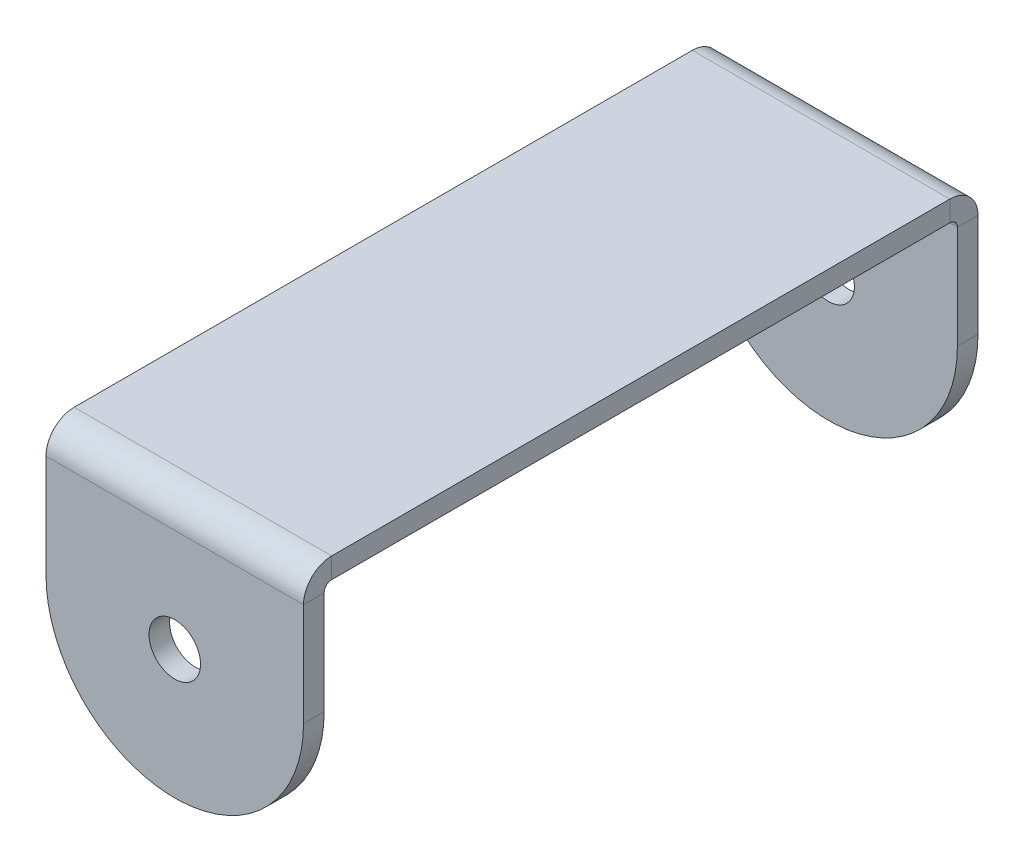
ISO-10303-21;
HEADER;
FILE_DESCRIPTION(('STEP AP214'),'2;1');
FILE_NAME('part.step','',(''),(''),'','','');
FILE_SCHEMA(('AUTOMOTIVE_DESIGN { 1 0 10303 214 1 1 1 1 }'));
ENDSEC;
DATA;
#1=APPLICATION_CONTEXT('core data for automotive mechanical design processes');
#2=APPLICATION_PROTOCOL_DEFINITION('international standard','automotive_design',2000,#1);
#3=PRODUCT_CONTEXT('',#1,'mechanical');
#4=PRODUCT('Part','Part','',(#3));
#5=PRODUCT_RELATED_PRODUCT_CATEGORY('part','',(#4));
#6=PRODUCT_DEFINITION_FORMATION('','',#4);
#7=PRODUCT_DEFINITION_CONTEXT('part definition',#1,'design');
#8=PRODUCT_DEFINITION('design','',#6,#7);
#9=PRODUCT_DEFINITION_SHAPE('','',#8);
#10=(LENGTH_UNIT() NAMED_UNIT(*) SI_UNIT(.MILLI.,.METRE.));
#11=(NAMED_UNIT(*) PLANE_ANGLE_UNIT() SI_UNIT($,.RADIAN.));
#12=(NAMED_UNIT(*) SI_UNIT($,.STERADIAN.) SOLID_ANGLE_UNIT());
#13=UNCERTAINTY_MEASURE_WITH_UNIT(LENGTH_MEASURE(1.E-05),#10,'distance_accuracy_value','');
#14=(GEOMETRIC_REPRESENTATION_CONTEXT(3) GLOBAL_UNCERTAINTY_ASSIGNED_CONTEXT((#13)) GLOBAL_UNIT_ASSIGNED_CONTEXT((#10,
#11,#12)) REPRESENTATION_CONTEXT('',''));
#15=CARTESIAN_POINT('',(0.,0.,0.));
#16=DIRECTION('',(0.,0.,1.));
#17=DIRECTION('',(1.,0.,0.));
#18=AXIS2_PLACEMENT_3D('',#15,#16,#17);
#19=CARTESIAN_POINT('',(0.,2.15149779794903E-13,-62.7366));
#20=DIRECTION('',(0.,0.,1.));
#21=DIRECTION('',(0.,-1.,0.));
#22=AXIS2_PLACEMENT_3D('',#19,#20,#21);
#23=PLANE('',#22);
#24=CARTESIAN_POINT('',(12.5,-12.7366,-62.7366));
#25=DIRECTION('',(0.,0.,1.));
#26=DIRECTION('',(0.,-1.,0.));
#27=AXIS2_PLACEMENT_3D('',#24,#25,#26);
#28=CIRCLE('',#27,12.5);
#29=CARTESIAN_POINT('',(25.,-12.7366,-62.7366));
#30=VERTEX_POINT('',#29);
#31=CARTESIAN_POINT('',(0.,-12.7366,-62.7366));
#32=VERTEX_POINT('',#31);
#33=EDGE_CURVE('E167',#30,#32,#28,.F.);
#34=ORIENTED_EDGE('',*,*,#33,.T.);
#35=DIRECTION('',(0.,1.,0.));
#36=VECTOR('',#35,1.);
#37=CARTESIAN_POINT('',(0.,2.15149779794903E-13,-62.7366));
#38=LINE('',#37,#36);
#39=CARTESIAN_POINT('',(0.,-2.73659999999999,-62.7366));
#40=VERTEX_POINT('',#39);
#41=EDGE_CURVE('E178',#32,#40,#38,.T.);
#42=ORIENTED_EDGE('',*,*,#41,.T.);
#43=DIRECTION('',(1.,0.,0.));
#44=VECTOR('',#43,1.);
#45=CARTESIAN_POINT('',(0.,-2.73659999999999,-62.7366));
#46=LINE('',#45,#44);
#47=CARTESIAN_POINT('',(25.,-2.73659999999999,-62.7366));
#48=VERTEX_POINT('',#47);
#49=EDGE_CURVE('E201',#48,#40,#46,.F.);
#50=ORIENTED_EDGE('',*,*,#49,.F.);
#51=DIRECTION('',(0.,-1.,0.));
#52=VECTOR('',#51,1.);
#53=CARTESIAN_POINT('',(25.,2.15149779794903E-13,-62.7366));
#54=LINE('',#53,#52);
#55=EDGE_CURVE('E181',#48,#30,#54,.T.);
#56=ORIENTED_EDGE('',*,*,#55,.T.);
#57=EDGE_LOOP('',(#34,#42,#50,#56));
#58=FACE_BOUND('',#57,.T.);
#59=CARTESIAN_POINT('',(12.5,-12.7366,-62.7366));
#60=DIRECTION('',(0.,0.,1.));
#61=DIRECTION('',(0.,-1.,0.));
#62=AXIS2_PLACEMENT_3D('',#59,#60,#61);
#63=CIRCLE('',#62,2.5);
#64=CARTESIAN_POINT('',(12.5,-15.2366,-62.7366));
#65=VERTEX_POINT('',#64);
#66=EDGE_CURVE('E591',#65,#65,#63,.T.);
#67=ORIENTED_EDGE('',*,*,#66,.T.);
#68=EDGE_LOOP('',(#67));
#69=FACE_BOUND('',#68,.T.);
#70=ADVANCED_FACE('F75',(#58,#69),#23,.F.);
#71=CARTESIAN_POINT('',(0.,2.08166817117217E-13,-60.7366));
#72=DIRECTION('',(0.,0.,1.));
#73=DIRECTION('',(0.,-1.,0.));
#74=AXIS2_PLACEMENT_3D('',#71,#72,#73);
#75=PLANE('',#74);
#76=DIRECTION('',(0.,-1.,0.));
#77=VECTOR('',#76,1.);
#78=CARTESIAN_POINT('',(0.,-2.,-60.7366));
#79=LINE('',#78,#77);
#80=CARTESIAN_POINT('',(0.,-12.7366,-60.7366));
#81=VERTEX_POINT('',#80);
#82=CARTESIAN_POINT('',(0.,-2.7366,-60.7366));
#83=VERTEX_POINT('',#82);
#84=EDGE_CURVE('E192',#81,#83,#79,.F.);
#85=ORIENTED_EDGE('',*,*,#84,.F.);
#86=CARTESIAN_POINT('',(12.5,-12.7366,-60.7366));
#87=DIRECTION('',(0.,0.,1.));
#88=DIRECTION('',(0.,-1.,0.));
#89=AXIS2_PLACEMENT_3D('',#86,#87,#88);
#90=CIRCLE('',#89,12.5);
#91=CARTESIAN_POINT('',(25.,-12.7366,-60.7366));
#92=VERTEX_POINT('',#91);
#93=EDGE_CURVE('E168',#92,#81,#90,.F.);
#94=ORIENTED_EDGE('',*,*,#93,.F.);
#95=DIRECTION('',(0.,1.,0.));
#96=VECTOR('',#95,1.);
#97=CARTESIAN_POINT('',(25.,-30.,-60.7366000000001));
#98=LINE('',#97,#96);
#99=CARTESIAN_POINT('',(25.,-2.7366,-60.7366));
#100=VERTEX_POINT('',#99);
#101=EDGE_CURVE('E198',#100,#92,#98,.F.);
#102=ORIENTED_EDGE('',*,*,#101,.F.);
#103=DIRECTION('',(1.,0.,0.));
#104=VECTOR('',#103,1.);
#105=CARTESIAN_POINT('',(0.,-2.7366,-60.7366));
#106=LINE('',#105,#104);
#107=EDGE_CURVE('E206',#83,#100,#106,.T.);
#108=ORIENTED_EDGE('',*,*,#107,.F.);
#109=EDGE_LOOP('',(#85,#94,#102,#108));
#110=FACE_BOUND('',#109,.T.);
#111=CARTESIAN_POINT('',(12.5,-12.7366,-60.7366));
#112=DIRECTION('',(0.,0.,1.));
#113=DIRECTION('',(0.,-1.,0.));
#114=AXIS2_PLACEMENT_3D('',#111,#112,#113);
#115=CIRCLE('',#114,2.5);
#116=CARTESIAN_POINT('',(12.5,-15.2366,-60.7366));
#117=VERTEX_POINT('',#116);
#118=EDGE_CURVE('E593',#117,#117,#115,.T.);
#119=ORIENTED_EDGE('',*,*,#118,.F.);
#120=EDGE_LOOP('',(#119));
#121=FACE_BOUND('',#120,.T.);
#122=ADVANCED_FACE('F321',(#110,#121),#75,.T.);
#123=CARTESIAN_POINT('',(25.,-30.,-62.7366000000001));
#124=DIRECTION('',(-1.,0.,0.));
#125=DIRECTION('',(0.,0.,1.));
#126=AXIS2_PLACEMENT_3D('',#123,#124,#125);
#127=PLANE('',#126);
#128=DIRECTION('',(0.,0.,1.));
#129=VECTOR('',#128,1.);
#130=CARTESIAN_POINT('',(25.,-12.7366,-60.7366));
#131=LINE('',#130,#129);
#132=EDGE_CURVE('E92',#92,#30,#131,.F.);
#133=ORIENTED_EDGE('',*,*,#132,.T.);
#134=ORIENTED_EDGE('',*,*,#55,.F.);
#135=DIRECTION('',(0.,0.,1.));
#136=VECTOR('',#135,1.);
#137=CARTESIAN_POINT('',(25.,-2.7366,-60.7366));
#138=LINE('',#137,#136);
#139=EDGE_CURVE('E203',#100,#48,#138,.F.);
#140=ORIENTED_EDGE('',*,*,#139,.F.);
#141=ORIENTED_EDGE('',*,*,#101,.T.);
#142=EDGE_LOOP('',(#133,#134,#140,#141));
#143=FACE_BOUND('',#142,.T.);
#144=ADVANCED_FACE('F326',(#143),#127,.F.);
#145=CARTESIAN_POINT('',(0.,0.,2.73659999999999));
#146=DIRECTION('',(0.,0.,-1.));
#147=DIRECTION('',(0.,1.,0.));
#148=AXIS2_PLACEMENT_3D('',#145,#146,#147);
#149=PLANE('',#148);
#150=CARTESIAN_POINT('',(12.5,-12.7366000000002,2.73660000000003));
#151=DIRECTION('',(0.,0.,-1.));
#152=DIRECTION('',(0.,1.,0.));
#153=AXIS2_PLACEMENT_3D('',#150,#151,#152);
#154=CIRCLE('',#153,12.5);
#155=CARTESIAN_POINT('',(0.,-12.7366,2.73660000000004));
#156=VERTEX_POINT('',#155);
#157=CARTESIAN_POINT('',(25.,-12.7366000000002,2.73660000000004));
#158=VERTEX_POINT('',#157);
#159=EDGE_CURVE('E580',#156,#158,#154,.F.);
#160=ORIENTED_EDGE('',*,*,#159,.T.);
#161=DIRECTION('',(0.,1.,0.));
#162=VECTOR('',#161,1.);
#163=CARTESIAN_POINT('',(25.,0.,2.73659999999999));
#164=LINE('',#163,#162);
#165=CARTESIAN_POINT('',(25.,-2.73659999999999,2.7366));
#166=VERTEX_POINT('',#165);
#167=EDGE_CURVE('E219',#158,#166,#164,.T.);
#168=ORIENTED_EDGE('',*,*,#167,.T.);
#169=DIRECTION('',(-1.,0.,0.));
#170=VECTOR('',#169,1.);
#171=CARTESIAN_POINT('',(25.,-2.7366,2.7366));
#172=LINE('',#171,#170);
#173=CARTESIAN_POINT('',(0.,-2.7366,2.7366));
#174=VERTEX_POINT('',#173);
#175=EDGE_CURVE('E230',#174,#166,#172,.F.);
#176=ORIENTED_EDGE('',*,*,#175,.F.);
#177=DIRECTION('',(0.,-1.,0.));
#178=VECTOR('',#177,1.);
#179=CARTESIAN_POINT('',(0.,0.,2.73659999999999));
#180=LINE('',#179,#178);
#181=EDGE_CURVE('E222',#174,#156,#180,.T.);
#182=ORIENTED_EDGE('',*,*,#181,.T.);
#183=EDGE_LOOP('',(#160,#168,#176,#182));
#184=FACE_BOUND('',#183,.T.);
#185=CARTESIAN_POINT('',(12.5,-12.7366000000002,2.73660000000003));
#186=DIRECTION('',(0.,0.,-1.));
#187=DIRECTION('',(0.,1.,0.));
#188=AXIS2_PLACEMENT_3D('',#185,#186,#187);
#189=CIRCLE('',#188,2.5);
#190=CARTESIAN_POINT('',(12.5,-10.2366000000002,2.73660000000002));
#191=VERTEX_POINT('',#190);
#192=EDGE_CURVE('E584',#191,#191,#189,.T.);
#193=ORIENTED_EDGE('',*,*,#192,.T.);
#194=EDGE_LOOP('',(#193));
#195=FACE_BOUND('',#194,.T.);
#196=ADVANCED_FACE('F337',(#184,#195),#149,.F.);
#197=CARTESIAN_POINT('',(0.,0.,0.73659999999999));
#198=DIRECTION('',(0.,0.,-1.));
#199=DIRECTION('',(0.,1.,0.));
#200=AXIS2_PLACEMENT_3D('',#197,#198,#199);
#201=PLANE('',#200);
#202=DIRECTION('',(0.,-1.,0.));
#203=VECTOR('',#202,1.);
#204=CARTESIAN_POINT('',(25.,-2.,0.736599999999997));
#205=LINE('',#204,#203);
#206=CARTESIAN_POINT('',(25.,-12.7366000000002,0.736600000000032));
#207=VERTEX_POINT('',#206);
#208=CARTESIAN_POINT('',(25.,-2.73659999999999,0.7366));
#209=VERTEX_POINT('',#208);
#210=EDGE_CURVE('E225',#207,#209,#205,.F.);
#211=ORIENTED_EDGE('',*,*,#210,.F.);
#212=CARTESIAN_POINT('',(12.5,-12.7366000000002,0.736600000000032));
#213=DIRECTION('',(0.,0.,-1.));
#214=DIRECTION('',(0.,1.,0.));
#215=AXIS2_PLACEMENT_3D('',#212,#213,#214);
#216=CIRCLE('',#215,12.5);
#217=CARTESIAN_POINT('',(0.,-12.7366000000002,0.736600000000035));
#218=VERTEX_POINT('',#217);
#219=EDGE_CURVE('E574',#218,#207,#216,.F.);
#220=ORIENTED_EDGE('',*,*,#219,.F.);
#221=DIRECTION('',(0.,1.,0.));
#222=VECTOR('',#221,1.);
#223=CARTESIAN_POINT('',(0.,-30.,0.736600000000095));
#224=LINE('',#223,#222);
#225=CARTESIAN_POINT('',(0.,-2.73659999999999,0.736599999999998));
#226=VERTEX_POINT('',#225);
#227=EDGE_CURVE('E227',#226,#218,#224,.F.);
#228=ORIENTED_EDGE('',*,*,#227,.F.);
#229=DIRECTION('',(-1.,0.,0.));
#230=VECTOR('',#229,1.);
#231=CARTESIAN_POINT('',(25.,-2.7366,0.7366));
#232=LINE('',#231,#230);
#233=EDGE_CURVE('E236',#209,#226,#232,.T.);
#234=ORIENTED_EDGE('',*,*,#233,.F.);
#235=EDGE_LOOP('',(#211,#220,#228,#234));
#236=FACE_BOUND('',#235,.T.);
#237=CARTESIAN_POINT('',(12.5,-12.7366000000002,0.736600000000032));
#238=DIRECTION('',(0.,0.,-1.));
#239=DIRECTION('',(0.,1.,0.));
#240=AXIS2_PLACEMENT_3D('',#237,#238,#239);
#241=CIRCLE('',#240,2.5);
#242=CARTESIAN_POINT('',(12.5,-10.2366000000002,0.736600000000023));
#243=VERTEX_POINT('',#242);
#244=EDGE_CURVE('E172',#243,#243,#241,.T.);
#245=ORIENTED_EDGE('',*,*,#244,.F.);
#246=EDGE_LOOP('',(#245));
#247=FACE_BOUND('',#246,.T.);
#248=ADVANCED_FACE('F420',(#236,#247),#201,.T.);
#249=CARTESIAN_POINT('',(0.,-30.,2.7366000000001));
#250=DIRECTION('',(1.,0.,0.));
#251=DIRECTION('',(0.,0.,-1.));
#252=AXIS2_PLACEMENT_3D('',#249,#250,#251);
#253=PLANE('',#252);
#254=DIRECTION('',(0.,0.,-1.));
#255=VECTOR('',#254,1.);
#256=CARTESIAN_POINT('',(0.,-12.7366,0.736600000000035));
#257=LINE('',#256,#255);
#258=EDGE_CURVE('E100',#218,#156,#257,.F.);
#259=ORIENTED_EDGE('',*,*,#258,.T.);
#260=ORIENTED_EDGE('',*,*,#181,.F.);
#261=DIRECTION('',(0.,0.,-1.));
#262=VECTOR('',#261,1.);
#263=CARTESIAN_POINT('',(0.,-2.7366,0.7366));
#264=LINE('',#263,#262);
#265=EDGE_CURVE('E233',#226,#174,#264,.F.);
#266=ORIENTED_EDGE('',*,*,#265,.F.);
#267=ORIENTED_EDGE('',*,*,#227,.T.);
#268=EDGE_LOOP('',(#259,#260,#266,#267));
#269=FACE_BOUND('',#268,.T.);
#270=ADVANCED_FACE('F431',(#269),#253,.F.);
#271=CARTESIAN_POINT('',(0.,-2.,0.));
#272=DIRECTION('',(-1.,0.,0.));
#273=DIRECTION('',(0.,0.,1.));
#274=AXIS2_PLACEMENT_3D('',#271,#272,#273);
#275=PLANE('',#274);
#276=DIRECTION('',(0.,0.,1.));
#277=VECTOR('',#276,1.);
#278=CARTESIAN_POINT('',(0.,0.,0.));
#279=LINE('',#278,#277);
#280=CARTESIAN_POINT('',(0.,0.,-60.));
#281=VERTEX_POINT('',#280);
#282=CARTESIAN_POINT('',(0.,0.,0.));
#283=VERTEX_POINT('',#282);
#284=EDGE_CURVE('E243',#281,#283,#279,.T.);
#285=ORIENTED_EDGE('',*,*,#284,.F.);
#286=DIRECTION('',(0.,1.,0.));
#287=VECTOR('',#286,1.);
#288=CARTESIAN_POINT('',(0.,-2.,-60.));
#289=LINE('',#288,#287);
#290=CARTESIAN_POINT('',(0.,-2.00000000000001,-60.));
#291=VERTEX_POINT('',#290);
#292=EDGE_CURVE('E13',#291,#281,#289,.T.);
#293=ORIENTED_EDGE('',*,*,#292,.F.);
#294=DIRECTION('',(0.,0.,1.));
#295=VECTOR('',#294,1.);
#296=CARTESIAN_POINT('',(0.,-2.,0.));
#297=LINE('',#296,#295);
#298=CARTESIAN_POINT('',(0.,-2.,0.));
#299=VERTEX_POINT('',#298);
#300=EDGE_CURVE('E252',#291,#299,#297,.T.);
#301=ORIENTED_EDGE('',*,*,#300,.T.);
#302=DIRECTION('',(0.,1.,0.));
#303=VECTOR('',#302,1.);
#304=CARTESIAN_POINT('',(0.,-2.,0.));
#305=LINE('',#304,#303);
#306=EDGE_CURVE('E79',#299,#283,#305,.T.);
#307=ORIENTED_EDGE('',*,*,#306,.T.);
#308=EDGE_LOOP('',(#285,#293,#301,#307));
#309=FACE_BOUND('',#308,.T.);
#310=ADVANCED_FACE('F77',(#309),#275,.T.);
#311=CARTESIAN_POINT('',(25.,-2.,0.));
#312=DIRECTION('',(1.,0.,0.));
#313=DIRECTION('',(0.,0.,-1.));
#314=AXIS2_PLACEMENT_3D('',#311,#312,#313);
#315=PLANE('',#314);
#316=DIRECTION('',(0.,0.,-1.));
#317=VECTOR('',#316,1.);
#318=CARTESIAN_POINT('',(25.,0.,0.));
#319=LINE('',#318,#317);
#320=CARTESIAN_POINT('',(25.,0.,0.));
#321=VERTEX_POINT('',#320);
#322=CARTESIAN_POINT('',(25.,0.,-60.));
#323=VERTEX_POINT('',#322);
#324=EDGE_CURVE('E268',#321,#323,#319,.T.);
#325=ORIENTED_EDGE('',*,*,#324,.F.);
#326=DIRECTION('',(0.,1.,0.));
#327=VECTOR('',#326,1.);
#328=CARTESIAN_POINT('',(25.,-2.,0.));
#329=LINE('',#328,#327);
#330=CARTESIAN_POINT('',(25.,-2.,0.));
#331=VERTEX_POINT('',#330);
#332=EDGE_CURVE('E274',#331,#321,#329,.T.);
#333=ORIENTED_EDGE('',*,*,#332,.F.);
#334=DIRECTION('',(0.,0.,-1.));
#335=VECTOR('',#334,1.);
#336=CARTESIAN_POINT('',(25.,-2.,0.));
#337=LINE('',#336,#335);
#338=CARTESIAN_POINT('',(25.,-2.00000000000001,-60.));
#339=VERTEX_POINT('',#338);
#340=EDGE_CURVE('E258',#331,#339,#337,.T.);
#341=ORIENTED_EDGE('',*,*,#340,.T.);
#342=DIRECTION('',(0.,1.,0.));
#343=VECTOR('',#342,1.);
#344=CARTESIAN_POINT('',(25.,-2.,-60.));
#345=LINE('',#344,#343);
#346=EDGE_CURVE('E84',#339,#323,#345,.T.);
#347=ORIENTED_EDGE('',*,*,#346,.T.);
#348=EDGE_LOOP('',(#325,#333,#341,#347));
#349=FACE_BOUND('',#348,.T.);
#350=ADVANCED_FACE('F296',(#349),#315,.T.);
#351=CARTESIAN_POINT('',(0.,-2.,0.));
#352=DIRECTION('',(0.,-1.,0.));
#353=DIRECTION('',(0.,0.,-1.));
#354=AXIS2_PLACEMENT_3D('',#351,#352,#353);
#355=PLANE('',#354);
#356=ORIENTED_EDGE('',*,*,#300,.F.);
#357=DIRECTION('',(-1.,0.,0.));
#358=VECTOR('',#357,1.);
#359=CARTESIAN_POINT('',(0.,-2.,-60.));
#360=LINE('',#359,#358);
#361=EDGE_CURVE('E261',#339,#291,#360,.T.);
#362=ORIENTED_EDGE('',*,*,#361,.F.);
#363=ORIENTED_EDGE('',*,*,#340,.F.);
#364=DIRECTION('',(1.,0.,0.));
#365=VECTOR('',#364,1.);
#366=CARTESIAN_POINT('',(0.,-2.,0.));
#367=LINE('',#366,#365);
#368=EDGE_CURVE('E255',#299,#331,#367,.T.);
#369=ORIENTED_EDGE('',*,*,#368,.F.);
#370=EDGE_LOOP('',(#356,#362,#363,#369));
#371=FACE_BOUND('',#370,.T.);
#372=ADVANCED_FACE('F301',(#371),#355,.T.);
#373=CARTESIAN_POINT('',(0.,0.,0.));
#374=DIRECTION('',(0.,-1.,0.));
#375=DIRECTION('',(0.,0.,-1.));
#376=AXIS2_PLACEMENT_3D('',#373,#374,#375);
#377=PLANE('',#376);
#378=ORIENTED_EDGE('',*,*,#284,.T.);
#379=DIRECTION('',(1.,0.,0.));
#380=VECTOR('',#379,1.);
#381=CARTESIAN_POINT('',(0.,0.,0.));
#382=LINE('',#381,#380);
#383=EDGE_CURVE('E265',#283,#321,#382,.T.);
#384=ORIENTED_EDGE('',*,*,#383,.T.);
#385=ORIENTED_EDGE('',*,*,#324,.T.);
#386=DIRECTION('',(-1.,0.,0.));
#387=VECTOR('',#386,1.);
#388=CARTESIAN_POINT('',(0.,0.,-60.));
#389=LINE('',#388,#387);
#390=EDGE_CURVE('E256',#323,#281,#389,.T.);
#391=ORIENTED_EDGE('',*,*,#390,.T.);
#392=EDGE_LOOP('',(#378,#384,#385,#391));
#393=FACE_BOUND('',#392,.T.);
#394=ADVANCED_FACE('F288',(#393),#377,.F.);
#395=CARTESIAN_POINT('',(25.,-2.7366,0.));
#396=DIRECTION('',(1.,0.,0.));
#397=DIRECTION('',(0.,0.,-1.));
#398=AXIS2_PLACEMENT_3D('',#395,#396,#397);
#399=PLANE('',#398);
#400=DIRECTION('',(0.,0.,-1.));
#401=VECTOR('',#400,1.);
#402=CARTESIAN_POINT('',(25.,-2.7366,2.7366));
#403=LINE('',#402,#401);
#404=EDGE_CURVE('E213',#209,#166,#403,.F.);
#405=ORIENTED_EDGE('',*,*,#404,.F.);
#406=CARTESIAN_POINT('',(25.,-2.7366,0.));
#407=DIRECTION('',(-1.,0.,0.));
#408=DIRECTION('',(0.,0.,1.));
#409=AXIS2_PLACEMENT_3D('',#406,#407,#408);
#410=CIRCLE('',#409,0.736599999999999);
#411=EDGE_CURVE('E247',#331,#209,#410,.F.);
#412=ORIENTED_EDGE('',*,*,#411,.F.);
#413=ORIENTED_EDGE('',*,*,#332,.T.);
#414=CARTESIAN_POINT('',(25.,-2.7366,0.));
#415=DIRECTION('',(-1.,0.,0.));
#416=DIRECTION('',(0.,0.,1.));
#417=AXIS2_PLACEMENT_3D('',#414,#415,#416);
#418=CIRCLE('',#417,2.7366);
#419=EDGE_CURVE('E240',#321,#166,#418,.F.);
#420=ORIENTED_EDGE('',*,*,#419,.T.);
#421=EDGE_LOOP('',(#405,#412,#413,#420));
#422=FACE_BOUND('',#421,.T.);
#423=ADVANCED_FACE('F506',(#422),#399,.T.);
#424=CARTESIAN_POINT('',(0.,-2.7366,0.));
#425=DIRECTION('',(1.,0.,0.));
#426=DIRECTION('',(0.,0.,-1.));
#427=AXIS2_PLACEMENT_3D('',#424,#425,#426);
#428=PLANE('',#427);
#429=CARTESIAN_POINT('',(0.,-2.7366,0.));
#430=DIRECTION('',(-1.,0.,0.));
#431=DIRECTION('',(0.,0.,1.));
#432=AXIS2_PLACEMENT_3D('',#429,#430,#431);
#433=CIRCLE('',#432,0.736599999999999);
#434=EDGE_CURVE('E221',#226,#299,#433,.T.);
#435=ORIENTED_EDGE('',*,*,#434,.F.);
#436=ORIENTED_EDGE('',*,*,#265,.T.);
#437=CARTESIAN_POINT('',(0.,-2.7366,0.));
#438=DIRECTION('',(-1.,0.,0.));
#439=DIRECTION('',(0.,0.,1.));
#440=AXIS2_PLACEMENT_3D('',#437,#438,#439);
#441=CIRCLE('',#440,2.7366);
#442=EDGE_CURVE('E244',#174,#283,#441,.T.);
#443=ORIENTED_EDGE('',*,*,#442,.T.);
#444=ORIENTED_EDGE('',*,*,#306,.F.);
#445=EDGE_LOOP('',(#435,#436,#443,#444));
#446=FACE_BOUND('',#445,.T.);
#447=ADVANCED_FACE('F495',(#446),#428,.F.);
#448=CARTESIAN_POINT('',(0.,-2.7366,0.));
#449=DIRECTION('',(-1.,0.,0.));
#450=DIRECTION('',(0.,0.,1.));
#451=AXIS2_PLACEMENT_3D('',#448,#449,#450);
#452=CYLINDRICAL_SURFACE('',#451,2.7366);
#453=ORIENTED_EDGE('',*,*,#383,.F.);
#454=ORIENTED_EDGE('',*,*,#442,.F.);
#455=ORIENTED_EDGE('',*,*,#175,.T.);
#456=ORIENTED_EDGE('',*,*,#419,.F.);
#457=EDGE_LOOP('',(#453,#454,#455,#456));
#458=FACE_BOUND('',#457,.T.);
#459=ADVANCED_FACE('F484',(#458),#452,.T.);
#460=CARTESIAN_POINT('',(0.,-2.7366,0.));
#461=DIRECTION('',(-1.,0.,0.));
#462=DIRECTION('',(0.,0.,1.));
#463=AXIS2_PLACEMENT_3D('',#460,#461,#462);
#464=CYLINDRICAL_SURFACE('',#463,0.736599999999999);
#465=ORIENTED_EDGE('',*,*,#368,.T.);
#466=ORIENTED_EDGE('',*,*,#411,.T.);
#467=ORIENTED_EDGE('',*,*,#233,.T.);
#468=ORIENTED_EDGE('',*,*,#434,.T.);
#469=EDGE_LOOP('',(#465,#466,#467,#468));
#470=FACE_BOUND('',#469,.T.);
#471=ADVANCED_FACE('F316',(#470),#464,.F.);
#472=CARTESIAN_POINT('',(25.,-1.99999999999999,2.7366));
#473=DIRECTION('',(-1.,0.,0.));
#474=DIRECTION('',(0.,0.,1.));
#475=AXIS2_PLACEMENT_3D('',#472,#473,#474);
#476=PLANE('',#475);
#477=ORIENTED_EDGE('',*,*,#167,.F.);
#478=DIRECTION('',(0.,0.,-1.));
#479=VECTOR('',#478,1.);
#480=CARTESIAN_POINT('',(25.,-12.7366000000002,0.736600000000032));
#481=LINE('',#480,#479);
#482=EDGE_CURVE('E209',#207,#158,#481,.F.);
#483=ORIENTED_EDGE('',*,*,#482,.F.);
#484=ORIENTED_EDGE('',*,*,#210,.T.);
#485=ORIENTED_EDGE('',*,*,#404,.T.);
#486=EDGE_LOOP('',(#477,#483,#484,#485));
#487=FACE_BOUND('',#486,.T.);
#488=ADVANCED_FACE('F309',(#487),#476,.F.);
#489=CARTESIAN_POINT('',(0.,-2.7366,-60.));
#490=DIRECTION('',(-1.,0.,0.));
#491=DIRECTION('',(0.,0.,1.));
#492=AXIS2_PLACEMENT_3D('',#489,#490,#491);
#493=PLANE('',#492);
#494=DIRECTION('',(0.,0.,1.));
#495=VECTOR('',#494,1.);
#496=CARTESIAN_POINT('',(0.,-2.73659999999999,-62.7366));
#497=LINE('',#496,#495);
#498=EDGE_CURVE('E186',#83,#40,#497,.F.);
#499=ORIENTED_EDGE('',*,*,#498,.F.);
#500=CARTESIAN_POINT('',(0.,-2.7366,-60.));
#501=DIRECTION('',(1.,0.,0.));
#502=DIRECTION('',(0.,0.,-1.));
#503=AXIS2_PLACEMENT_3D('',#500,#501,#502);
#504=CIRCLE('',#503,0.736599999999997);
#505=EDGE_CURVE('E190',#291,#83,#504,.F.);
#506=ORIENTED_EDGE('',*,*,#505,.F.);
#507=ORIENTED_EDGE('',*,*,#292,.T.);
#508=CARTESIAN_POINT('',(0.,-2.7366,-60.));
#509=DIRECTION('',(1.,0.,0.));
#510=DIRECTION('',(0.,0.,-1.));
#511=AXIS2_PLACEMENT_3D('',#508,#509,#510);
#512=CIRCLE('',#511,2.7366);
#513=EDGE_CURVE('E210',#281,#40,#512,.F.);
#514=ORIENTED_EDGE('',*,*,#513,.T.);
#515=EDGE_LOOP('',(#499,#506,#507,#514));
#516=FACE_BOUND('',#515,.T.);
#517=ADVANCED_FACE('F307',(#516),#493,.T.);
#518=CARTESIAN_POINT('',(25.,-2.7366,-60.));
#519=DIRECTION('',(-1.,0.,0.));
#520=DIRECTION('',(0.,0.,1.));
#521=AXIS2_PLACEMENT_3D('',#518,#519,#520);
#522=PLANE('',#521);
#523=CARTESIAN_POINT('',(25.,-2.7366,-60.));
#524=DIRECTION('',(1.,0.,0.));
#525=DIRECTION('',(0.,0.,-1.));
#526=AXIS2_PLACEMENT_3D('',#523,#524,#525);
#527=CIRCLE('',#526,0.736599999999997);
#528=EDGE_CURVE('E187',#100,#339,#527,.T.);
#529=ORIENTED_EDGE('',*,*,#528,.F.);
#530=ORIENTED_EDGE('',*,*,#139,.T.);
#531=CARTESIAN_POINT('',(25.,-2.7366,-60.));
#532=DIRECTION('',(1.,0.,0.));
#533=DIRECTION('',(0.,0.,-1.));
#534=AXIS2_PLACEMENT_3D('',#531,#532,#533);
#535=CIRCLE('',#534,2.7366);
#536=EDGE_CURVE('E214',#48,#323,#535,.T.);
#537=ORIENTED_EDGE('',*,*,#536,.T.);
#538=ORIENTED_EDGE('',*,*,#346,.F.);
#539=EDGE_LOOP('',(#529,#530,#537,#538));
#540=FACE_BOUND('',#539,.T.);
#541=ADVANCED_FACE('F293',(#540),#522,.F.);
#542=CARTESIAN_POINT('',(25.,-2.7366,-60.));
#543=DIRECTION('',(1.,0.,0.));
#544=DIRECTION('',(0.,0.,-1.));
#545=AXIS2_PLACEMENT_3D('',#542,#543,#544);
#546=CYLINDRICAL_SURFACE('',#545,2.7366);
#547=ORIENTED_EDGE('',*,*,#390,.F.);
#548=ORIENTED_EDGE('',*,*,#536,.F.);
#549=ORIENTED_EDGE('',*,*,#49,.T.);
#550=ORIENTED_EDGE('',*,*,#513,.F.);
#551=EDGE_LOOP('',(#547,#548,#549,#550));
#552=FACE_BOUND('',#551,.T.);
#553=ADVANCED_FACE('F290',(#552),#546,.T.);
#554=CARTESIAN_POINT('',(25.,-2.7366,-60.));
#555=DIRECTION('',(1.,0.,0.));
#556=DIRECTION('',(0.,0.,-1.));
#557=AXIS2_PLACEMENT_3D('',#554,#555,#556);
#558=CYLINDRICAL_SURFACE('',#557,0.736599999999997);
#559=ORIENTED_EDGE('',*,*,#361,.T.);
#560=ORIENTED_EDGE('',*,*,#505,.T.);
#561=ORIENTED_EDGE('',*,*,#107,.T.);
#562=ORIENTED_EDGE('',*,*,#528,.T.);
#563=EDGE_LOOP('',(#559,#560,#561,#562));
#564=FACE_BOUND('',#563,.T.);
#565=ADVANCED_FACE('F304',(#564),#558,.F.);
#566=CARTESIAN_POINT('',(0.,-1.99999999999999,-62.7366));
#567=DIRECTION('',(1.,0.,0.));
#568=DIRECTION('',(0.,0.,-1.));
#569=AXIS2_PLACEMENT_3D('',#566,#567,#568);
#570=PLANE('',#569);
#571=ORIENTED_EDGE('',*,*,#41,.F.);
#572=DIRECTION('',(0.,0.,1.));
#573=VECTOR('',#572,1.);
#574=CARTESIAN_POINT('',(0.,-12.7366,-60.7366));
#575=LINE('',#574,#573);
#576=EDGE_CURVE('E164',#81,#32,#575,.F.);
#577=ORIENTED_EDGE('',*,*,#576,.F.);
#578=ORIENTED_EDGE('',*,*,#84,.T.);
#579=ORIENTED_EDGE('',*,*,#498,.T.);
#580=EDGE_LOOP('',(#571,#577,#578,#579));
#581=FACE_BOUND('',#580,.T.);
#582=ADVANCED_FACE('F184',(#581),#570,.F.);
#583=CARTESIAN_POINT('',(12.5,-12.7366000000002,0.736600000000032));
#584=DIRECTION('',(0.,0.,-1.));
#585=DIRECTION('',(0.,1.,0.));
#586=AXIS2_PLACEMENT_3D('',#583,#584,#585);
#587=CYLINDRICAL_SURFACE('',#586,12.5);
#588=ORIENTED_EDGE('',*,*,#219,.T.);
#589=ORIENTED_EDGE('',*,*,#482,.T.);
#590=ORIENTED_EDGE('',*,*,#159,.F.);
#591=ORIENTED_EDGE('',*,*,#258,.F.);
#592=EDGE_LOOP('',(#588,#589,#590,#591));
#593=FACE_BOUND('',#592,.T.);
#594=ADVANCED_FACE('F330',(#593),#587,.T.);
#595=CARTESIAN_POINT('',(12.5,-12.7366000000002,0.736600000000032));
#596=DIRECTION('',(0.,0.,-1.));
#597=DIRECTION('',(0.,1.,0.));
#598=AXIS2_PLACEMENT_3D('',#595,#596,#597);
#599=CYLINDRICAL_SURFACE('',#598,2.5);
#600=ORIENTED_EDGE('',*,*,#192,.F.);
#601=EDGE_LOOP('',(#600));
#602=FACE_BOUND('',#601,.T.);
#603=ORIENTED_EDGE('',*,*,#244,.T.);
#604=EDGE_LOOP('',(#603));
#605=FACE_BOUND('',#604,.T.);
#606=ADVANCED_FACE('F356',(#602,#605),#599,.F.);
#607=CARTESIAN_POINT('',(12.5,-12.7366,-60.7366));
#608=DIRECTION('',(0.,0.,1.));
#609=DIRECTION('',(0.,-1.,0.));
#610=AXIS2_PLACEMENT_3D('',#607,#608,#609);
#611=CYLINDRICAL_SURFACE('',#610,12.5);
#612=ORIENTED_EDGE('',*,*,#93,.T.);
#613=ORIENTED_EDGE('',*,*,#576,.T.);
#614=ORIENTED_EDGE('',*,*,#33,.F.);
#615=ORIENTED_EDGE('',*,*,#132,.F.);
#616=EDGE_LOOP('',(#612,#613,#614,#615));
#617=FACE_BOUND('',#616,.T.);
#618=ADVANCED_FACE('F166',(#617),#611,.T.);
#619=CARTESIAN_POINT('',(12.5,-12.7366,-60.7366));
#620=DIRECTION('',(0.,0.,1.));
#621=DIRECTION('',(0.,-1.,0.));
#622=AXIS2_PLACEMENT_3D('',#619,#620,#621);
#623=CYLINDRICAL_SURFACE('',#622,2.5);
#624=ORIENTED_EDGE('',*,*,#66,.F.);
#625=EDGE_LOOP('',(#624));
#626=FACE_BOUND('',#625,.T.);
#627=ORIENTED_EDGE('',*,*,#118,.T.);
#628=EDGE_LOOP('',(#627));
#629=FACE_BOUND('',#628,.T.);
#630=ADVANCED_FACE('F368',(#626,#629),#623,.F.);
#631=CLOSED_SHELL('',(#70,#122,#144,#196,#248,#270,#310,#350,#372,#394,#423,#447,#459,#471,#488,
#517,#541,#553,#565,#582,#594,#606,#618,#630));
#632=MANIFOLD_SOLID_BREP('B2',#631);
#633=ADVANCED_BREP_SHAPE_REPRESENTATION('',(#18,#632),#14);
#634=SHAPE_DEFINITION_REPRESENTATION(#9,#633);
ENDSEC;
END-ISO-10303-21;
